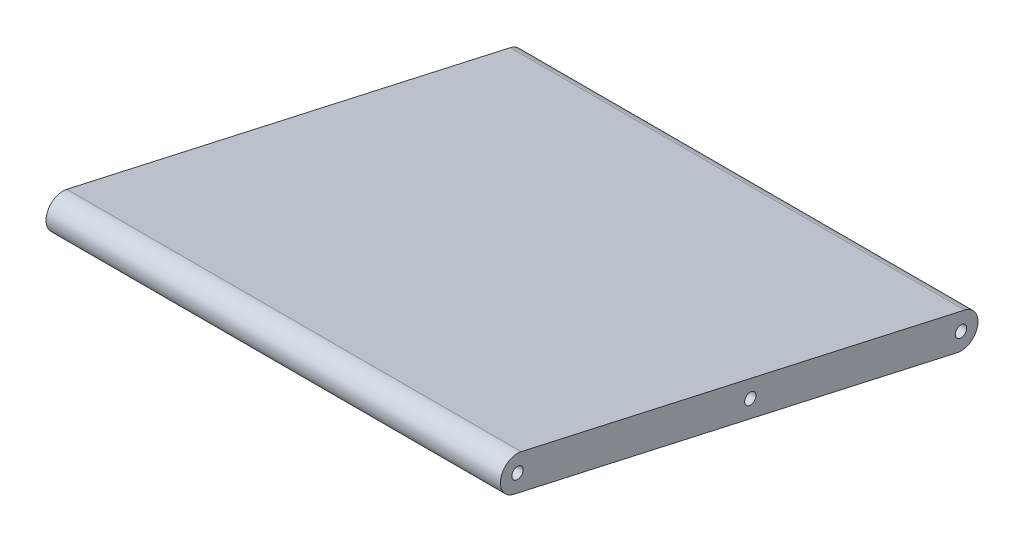
ISO-10303-21;
HEADER;
FILE_DESCRIPTION(('STEP AP214'),'2;1');
FILE_NAME('part.step','',(''),(''),'','','');
FILE_SCHEMA(('AUTOMOTIVE_DESIGN { 1 0 10303 214 1 1 1 1 }'));
ENDSEC;
DATA;
#1=APPLICATION_CONTEXT('core data for automotive mechanical design processes');
#2=APPLICATION_PROTOCOL_DEFINITION('international standard','automotive_design',2000,#1);
#3=PRODUCT_CONTEXT('',#1,'mechanical');
#4=PRODUCT('Part','Part','',(#3));
#5=PRODUCT_RELATED_PRODUCT_CATEGORY('part','',(#4));
#6=PRODUCT_DEFINITION_FORMATION('','',#4);
#7=PRODUCT_DEFINITION_CONTEXT('part definition',#1,'design');
#8=PRODUCT_DEFINITION('design','',#6,#7);
#9=PRODUCT_DEFINITION_SHAPE('','',#8);
#10=(LENGTH_UNIT() NAMED_UNIT(*) SI_UNIT(.MILLI.,.METRE.));
#11=(NAMED_UNIT(*) PLANE_ANGLE_UNIT() SI_UNIT($,.RADIAN.));
#12=(NAMED_UNIT(*) SI_UNIT($,.STERADIAN.) SOLID_ANGLE_UNIT());
#13=UNCERTAINTY_MEASURE_WITH_UNIT(LENGTH_MEASURE(1.E-05),#10,'distance_accuracy_value','');
#14=(GEOMETRIC_REPRESENTATION_CONTEXT(3) GLOBAL_UNCERTAINTY_ASSIGNED_CONTEXT((#13)) GLOBAL_UNIT_ASSIGNED_CONTEXT((#10,
#11,#12)) REPRESENTATION_CONTEXT('',''));
#15=CARTESIAN_POINT('',(0.,0.,0.));
#16=DIRECTION('',(0.,0.,1.));
#17=DIRECTION('',(1.,0.,0.));
#18=AXIS2_PLACEMENT_3D('',#15,#16,#17);
#19=CARTESIAN_POINT('',(10.,-6.4620300995487,12.3170228121561));
#20=DIRECTION('',(1.,0.,0.));
#21=DIRECTION('',(0.,0.,-1.));
#22=AXIS2_PLACEMENT_3D('',#19,#20,#21);
#23=PLANE('',#22);
#24=CARTESIAN_POINT('',(10.,-8.64226257126925,2.55758705135232));
#25=DIRECTION('',(1.,0.,0.));
#26=DIRECTION('',(0.,0.,-1.));
#27=AXIS2_PLACEMENT_3D('',#24,#25,#26);
#28=CIRCLE('',#27,0.125);
#29=CARTESIAN_POINT('',(10.,-8.64226257126925,2.43258705135232));
#30=VERTEX_POINT('',#29);
#31=EDGE_CURVE('E115',#30,#30,#28,.T.);
#32=ORIENTED_EDGE('',*,*,#31,.F.);
#33=EDGE_LOOP('',(#32));
#34=FACE_BOUND('',#33,.T.);
#35=CARTESIAN_POINT('',(10.,-6.4620300995487,12.3170228121561));
#36=DIRECTION('',(1.,0.,0.));
#37=DIRECTION('',(0.,0.,-1.));
#38=AXIS2_PLACEMENT_3D('',#35,#36,#37);
#39=CIRCLE('',#38,0.375000000000001);
#40=CARTESIAN_POINT('',(10.,-6.09605125851855,12.2352640944666));
#41=VERTEX_POINT('',#40);
#42=CARTESIAN_POINT('',(10.,-6.82800894057884,12.3987815298456));
#43=VERTEX_POINT('',#42);
#44=EDGE_CURVE('E85',#41,#43,#39,.T.);
#45=ORIENTED_EDGE('',*,*,#44,.T.);
#46=DIRECTION('',(0.,-0.218023247172056,-0.975943576080376));
#47=VECTOR('',#46,1.);
#48=CARTESIAN_POINT('',(10.,-6.82800894057884,12.3987815298456));
#49=LINE('',#48,#47);
#50=CARTESIAN_POINT('',(10.,-9.0082414122994,2.63934576904184));
#51=VERTEX_POINT('',#50);
#52=EDGE_CURVE('E80',#43,#51,#49,.T.);
#53=ORIENTED_EDGE('',*,*,#52,.T.);
#54=CARTESIAN_POINT('',(10.,-8.64226257126925,2.55758705135232));
#55=DIRECTION('',(1.,0.,0.));
#56=DIRECTION('',(0.,0.,-1.));
#57=AXIS2_PLACEMENT_3D('',#54,#55,#56);
#58=CIRCLE('',#57,0.375000000000001);
#59=CARTESIAN_POINT('',(10.,-8.27628373023911,2.4758283336628));
#60=VERTEX_POINT('',#59);
#61=EDGE_CURVE('E83',#51,#60,#58,.T.);
#62=ORIENTED_EDGE('',*,*,#61,.T.);
#63=DIRECTION('',(0.,0.218023247172056,0.975943576080376));
#64=VECTOR('',#63,1.);
#65=CARTESIAN_POINT('',(10.,-6.09605125851855,12.2352640944666));
#66=LINE('',#65,#64);
#67=EDGE_CURVE('E50',#60,#41,#66,.T.);
#68=ORIENTED_EDGE('',*,*,#67,.T.);
#69=EDGE_LOOP('',(#45,#53,#62,#68));
#70=FACE_BOUND('',#69,.T.);
#71=CARTESIAN_POINT('',(10.,-7.60665214720199,7.19331903773411));
#72=DIRECTION('',(1.,0.,0.));
#73=DIRECTION('',(0.,0.,-1.));
#74=AXIS2_PLACEMENT_3D('',#71,#72,#73);
#75=CIRCLE('',#74,0.125);
#76=CARTESIAN_POINT('',(10.,-7.60665214720199,7.06831903773411));
#77=VERTEX_POINT('',#76);
#78=EDGE_CURVE('E100',#77,#77,#75,.T.);
#79=ORIENTED_EDGE('',*,*,#78,.F.);
#80=EDGE_LOOP('',(#79));
#81=FACE_BOUND('',#80,.T.);
#82=CARTESIAN_POINT('',(10.,-6.4620300995487,12.3170228121561));
#83=DIRECTION('',(1.,0.,0.));
#84=DIRECTION('',(0.,0.,-1.));
#85=AXIS2_PLACEMENT_3D('',#82,#83,#84);
#86=CIRCLE('',#85,0.125);
#87=CARTESIAN_POINT('',(10.,-6.4620300995487,12.1920228121561));
#88=VERTEX_POINT('',#87);
#89=EDGE_CURVE('E121',#88,#88,#86,.T.);
#90=ORIENTED_EDGE('',*,*,#89,.F.);
#91=EDGE_LOOP('',(#90));
#92=FACE_BOUND('',#91,.T.);
#93=ADVANCED_FACE('F33',(#34,#70,#81,#92),#23,.T.);
#94=CARTESIAN_POINT('',(0.,-6.4620300995487,12.3170228121561));
#95=DIRECTION('',(1.,0.,0.));
#96=DIRECTION('',(0.,0.,-1.));
#97=AXIS2_PLACEMENT_3D('',#94,#95,#96);
#98=PLANE('',#97);
#99=CARTESIAN_POINT('',(0.,-6.4620300995487,12.3170228121561));
#100=DIRECTION('',(1.,0.,0.));
#101=DIRECTION('',(0.,0.,-1.));
#102=AXIS2_PLACEMENT_3D('',#99,#100,#101);
#103=CIRCLE('',#102,0.375000000000001);
#104=CARTESIAN_POINT('',(0.,-6.09605125851855,12.2352640944666));
#105=VERTEX_POINT('',#104);
#106=CARTESIAN_POINT('',(0.,-6.82800894057884,12.3987815298456));
#107=VERTEX_POINT('',#106);
#108=EDGE_CURVE('E97',#105,#107,#103,.T.);
#109=ORIENTED_EDGE('',*,*,#108,.F.);
#110=DIRECTION('',(0.,0.218023247172056,0.975943576080376));
#111=VECTOR('',#110,1.);
#112=CARTESIAN_POINT('',(0.,-6.09605125851855,12.2352640944666));
#113=LINE('',#112,#111);
#114=CARTESIAN_POINT('',(0.,-8.27628373023911,2.4758283336628));
#115=VERTEX_POINT('',#114);
#116=EDGE_CURVE('E73',#115,#105,#113,.T.);
#117=ORIENTED_EDGE('',*,*,#116,.F.);
#118=CARTESIAN_POINT('',(0.,-8.64226257126925,2.55758705135232));
#119=DIRECTION('',(1.,0.,0.));
#120=DIRECTION('',(0.,0.,-1.));
#121=AXIS2_PLACEMENT_3D('',#118,#119,#120);
#122=CIRCLE('',#121,0.375000000000001);
#123=CARTESIAN_POINT('',(0.,-9.0082414122994,2.63934576904184));
#124=VERTEX_POINT('',#123);
#125=EDGE_CURVE('E67',#124,#115,#122,.T.);
#126=ORIENTED_EDGE('',*,*,#125,.F.);
#127=DIRECTION('',(0.,-0.218023247172056,-0.975943576080376));
#128=VECTOR('',#127,1.);
#129=CARTESIAN_POINT('',(0.,-6.82800894057884,12.3987815298456));
#130=LINE('',#129,#128);
#131=EDGE_CURVE('E89',#107,#124,#130,.T.);
#132=ORIENTED_EDGE('',*,*,#131,.F.);
#133=EDGE_LOOP('',(#109,#117,#126,#132));
#134=FACE_BOUND('',#133,.T.);
#135=CARTESIAN_POINT('',(0.,-7.60665214720199,7.19331903773411));
#136=DIRECTION('',(1.,0.,0.));
#137=DIRECTION('',(0.,0.,-1.));
#138=AXIS2_PLACEMENT_3D('',#135,#136,#137);
#139=CIRCLE('',#138,0.125);
#140=CARTESIAN_POINT('',(0.,-7.60665214720199,7.06831903773411));
#141=VERTEX_POINT('',#140);
#142=EDGE_CURVE('E112',#141,#141,#139,.T.);
#143=ORIENTED_EDGE('',*,*,#142,.T.);
#144=EDGE_LOOP('',(#143));
#145=FACE_BOUND('',#144,.T.);
#146=CARTESIAN_POINT('',(0.,-8.64226257126925,2.55758705135232));
#147=DIRECTION('',(1.,0.,0.));
#148=DIRECTION('',(0.,0.,-1.));
#149=AXIS2_PLACEMENT_3D('',#146,#147,#148);
#150=CIRCLE('',#149,0.125);
#151=CARTESIAN_POINT('',(0.,-8.64226257126925,2.43258705135232));
#152=VERTEX_POINT('',#151);
#153=EDGE_CURVE('E118',#152,#152,#150,.T.);
#154=ORIENTED_EDGE('',*,*,#153,.T.);
#155=EDGE_LOOP('',(#154));
#156=FACE_BOUND('',#155,.T.);
#157=CARTESIAN_POINT('',(0.,-6.4620300995487,12.3170228121561));
#158=DIRECTION('',(1.,0.,0.));
#159=DIRECTION('',(0.,0.,-1.));
#160=AXIS2_PLACEMENT_3D('',#157,#158,#159);
#161=CIRCLE('',#160,0.125);
#162=CARTESIAN_POINT('',(0.,-6.4620300995487,12.1920228121561));
#163=VERTEX_POINT('',#162);
#164=EDGE_CURVE('E124',#163,#163,#161,.T.);
#165=ORIENTED_EDGE('',*,*,#164,.T.);
#166=EDGE_LOOP('',(#165));
#167=FACE_BOUND('',#166,.T.);
#168=ADVANCED_FACE('F108',(#134,#145,#156,#167),#98,.F.);
#169=CARTESIAN_POINT('',(10.,-6.4620300995487,12.3170228121561));
#170=DIRECTION('',(-1.,0.,0.));
#171=DIRECTION('',(0.,0.,1.));
#172=AXIS2_PLACEMENT_3D('',#169,#170,#171);
#173=CYLINDRICAL_SURFACE('',#172,0.375000000000001);
#174=ORIENTED_EDGE('',*,*,#108,.T.);
#175=DIRECTION('',(-1.,0.,0.));
#176=VECTOR('',#175,1.);
#177=CARTESIAN_POINT('',(10.,-6.82800894057884,12.3987815298456));
#178=LINE('',#177,#176);
#179=EDGE_CURVE('E11',#43,#107,#178,.T.);
#180=ORIENTED_EDGE('',*,*,#179,.F.);
#181=ORIENTED_EDGE('',*,*,#44,.F.);
#182=DIRECTION('',(-1.,0.,0.));
#183=VECTOR('',#182,1.);
#184=CARTESIAN_POINT('',(10.,-6.09605125851855,12.2352640944666));
#185=LINE('',#184,#183);
#186=EDGE_CURVE('E93',#41,#105,#185,.T.);
#187=ORIENTED_EDGE('',*,*,#186,.T.);
#188=EDGE_LOOP('',(#174,#180,#181,#187));
#189=FACE_BOUND('',#188,.T.);
#190=ADVANCED_FACE('F35',(#189),#173,.T.);
#191=CARTESIAN_POINT('',(10.,-6.82800894057884,12.3987815298456));
#192=DIRECTION('',(0.,0.975943576080376,-0.218023247172056));
#193=DIRECTION('',(0.,0.218023247172056,0.975943576080376));
#194=AXIS2_PLACEMENT_3D('',#191,#192,#193);
#195=PLANE('',#194);
#196=ORIENTED_EDGE('',*,*,#131,.T.);
#197=DIRECTION('',(-1.,0.,0.));
#198=VECTOR('',#197,1.);
#199=CARTESIAN_POINT('',(10.,-9.0082414122994,2.63934576904184));
#200=LINE('',#199,#198);
#201=EDGE_CURVE('E42',#51,#124,#200,.T.);
#202=ORIENTED_EDGE('',*,*,#201,.F.);
#203=ORIENTED_EDGE('',*,*,#52,.F.);
#204=ORIENTED_EDGE('',*,*,#179,.T.);
#205=EDGE_LOOP('',(#196,#202,#203,#204));
#206=FACE_BOUND('',#205,.T.);
#207=ADVANCED_FACE('F88',(#206),#195,.F.);
#208=CARTESIAN_POINT('',(10.,-8.64226257126925,2.55758705135232));
#209=DIRECTION('',(-1.,0.,0.));
#210=DIRECTION('',(0.,0.,1.));
#211=AXIS2_PLACEMENT_3D('',#208,#209,#210);
#212=CYLINDRICAL_SURFACE('',#211,0.375000000000001);
#213=ORIENTED_EDGE('',*,*,#125,.T.);
#214=DIRECTION('',(-1.,0.,0.));
#215=VECTOR('',#214,1.);
#216=CARTESIAN_POINT('',(10.,-8.27628373023911,2.4758283336628));
#217=LINE('',#216,#215);
#218=EDGE_CURVE('E90',#60,#115,#217,.T.);
#219=ORIENTED_EDGE('',*,*,#218,.F.);
#220=ORIENTED_EDGE('',*,*,#61,.F.);
#221=ORIENTED_EDGE('',*,*,#201,.T.);
#222=EDGE_LOOP('',(#213,#219,#220,#221));
#223=FACE_BOUND('',#222,.T.);
#224=ADVANCED_FACE('F91',(#223),#212,.T.);
#225=CARTESIAN_POINT('',(10.,-6.09605125851855,12.2352640944666));
#226=DIRECTION('',(0.,-0.975943576080376,0.218023247172056));
#227=DIRECTION('',(0.,-0.218023247172056,-0.975943576080376));
#228=AXIS2_PLACEMENT_3D('',#225,#226,#227);
#229=PLANE('',#228);
#230=ORIENTED_EDGE('',*,*,#116,.T.);
#231=ORIENTED_EDGE('',*,*,#186,.F.);
#232=ORIENTED_EDGE('',*,*,#67,.F.);
#233=ORIENTED_EDGE('',*,*,#218,.T.);
#234=EDGE_LOOP('',(#230,#231,#232,#233));
#235=FACE_BOUND('',#234,.T.);
#236=ADVANCED_FACE('F105',(#235),#229,.F.);
#237=CARTESIAN_POINT('',(10.,-7.60665214720199,7.19331903773411));
#238=DIRECTION('',(-1.,0.,0.));
#239=DIRECTION('',(0.,0.,1.));
#240=AXIS2_PLACEMENT_3D('',#237,#238,#239);
#241=CYLINDRICAL_SURFACE('',#240,0.125);
#242=ORIENTED_EDGE('',*,*,#78,.T.);
#243=EDGE_LOOP('',(#242));
#244=FACE_BOUND('',#243,.T.);
#245=ORIENTED_EDGE('',*,*,#142,.F.);
#246=EDGE_LOOP('',(#245));
#247=FACE_BOUND('',#246,.T.);
#248=ADVANCED_FACE('F142',(#244,#247),#241,.F.);
#249=CARTESIAN_POINT('',(10.,-8.64226257126925,2.55758705135232));
#250=DIRECTION('',(-1.,0.,0.));
#251=DIRECTION('',(0.,0.,1.));
#252=AXIS2_PLACEMENT_3D('',#249,#250,#251);
#253=CYLINDRICAL_SURFACE('',#252,0.125);
#254=ORIENTED_EDGE('',*,*,#31,.T.);
#255=EDGE_LOOP('',(#254));
#256=FACE_BOUND('',#255,.T.);
#257=ORIENTED_EDGE('',*,*,#153,.F.);
#258=EDGE_LOOP('',(#257));
#259=FACE_BOUND('',#258,.T.);
#260=ADVANCED_FACE('F188',(#256,#259),#253,.F.);
#261=CARTESIAN_POINT('',(10.,-6.4620300995487,12.3170228121561));
#262=DIRECTION('',(-1.,0.,0.));
#263=DIRECTION('',(0.,0.,1.));
#264=AXIS2_PLACEMENT_3D('',#261,#262,#263);
#265=CYLINDRICAL_SURFACE('',#264,0.125);
#266=ORIENTED_EDGE('',*,*,#89,.T.);
#267=EDGE_LOOP('',(#266));
#268=FACE_BOUND('',#267,.T.);
#269=ORIENTED_EDGE('',*,*,#164,.F.);
#270=EDGE_LOOP('',(#269));
#271=FACE_BOUND('',#270,.T.);
#272=ADVANCED_FACE('F130',(#268,#271),#265,.F.);
#273=CLOSED_SHELL('',(#93,#168,#190,#207,#224,#236,#248,#260,#272));
#274=MANIFOLD_SOLID_BREP('B2',#273);
#275=ADVANCED_BREP_SHAPE_REPRESENTATION('',(#18,#274),#14);
#276=SHAPE_DEFINITION_REPRESENTATION(#9,#275);
ENDSEC;
END-ISO-10303-21;
